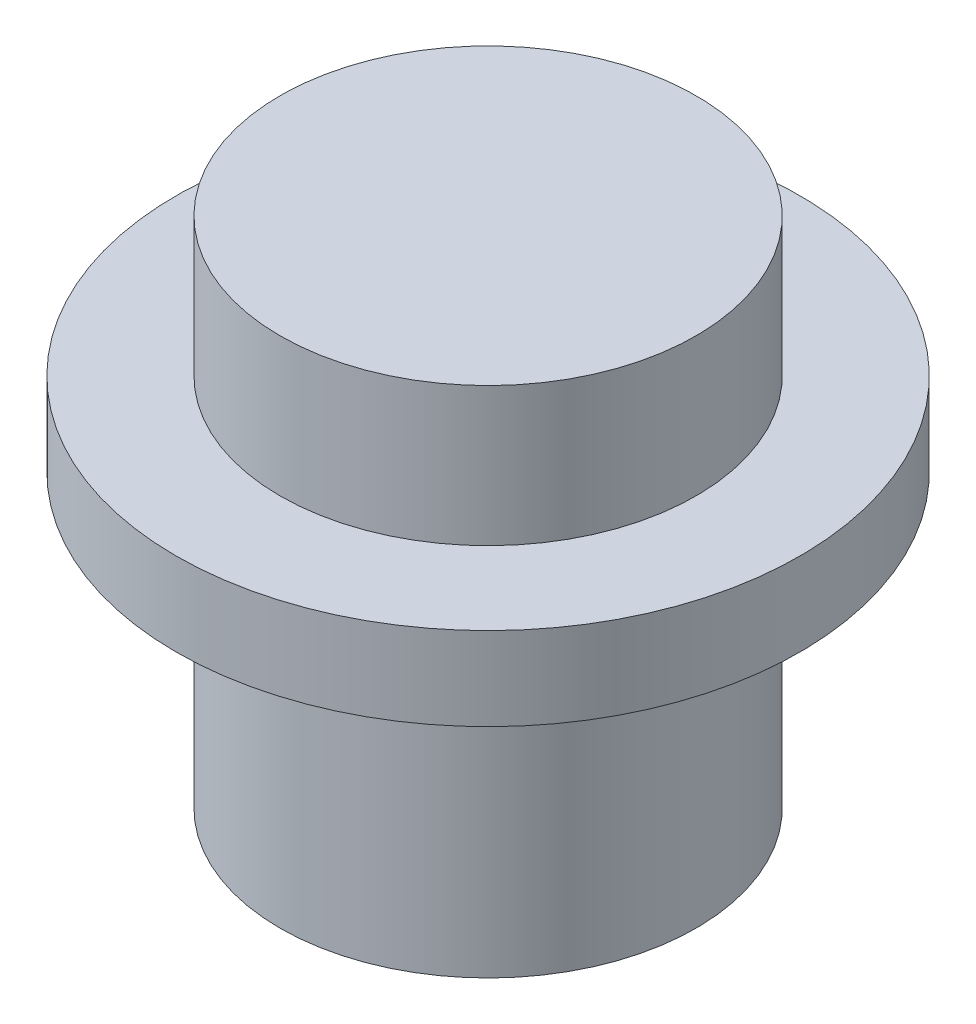
ISO-10303-21;
HEADER;
FILE_DESCRIPTION(('STEP AP214'),'2;1');
FILE_NAME('part.step','',(''),(''),'','','');
FILE_SCHEMA(('AUTOMOTIVE_DESIGN { 1 0 10303 214 1 1 1 1 }'));
ENDSEC;
DATA;
#1=APPLICATION_CONTEXT('core data for automotive mechanical design processes');
#2=APPLICATION_PROTOCOL_DEFINITION('international standard','automotive_design',2000,#1);
#3=PRODUCT_CONTEXT('',#1,'mechanical');
#4=PRODUCT('Part','Part','',(#3));
#5=PRODUCT_RELATED_PRODUCT_CATEGORY('part','',(#4));
#6=PRODUCT_DEFINITION_FORMATION('','',#4);
#7=PRODUCT_DEFINITION_CONTEXT('part definition',#1,'design');
#8=PRODUCT_DEFINITION('design','',#6,#7);
#9=PRODUCT_DEFINITION_SHAPE('','',#8);
#10=(LENGTH_UNIT() NAMED_UNIT(*) SI_UNIT(.MILLI.,.METRE.));
#11=(NAMED_UNIT(*) PLANE_ANGLE_UNIT() SI_UNIT($,.RADIAN.));
#12=(NAMED_UNIT(*) SI_UNIT($,.STERADIAN.) SOLID_ANGLE_UNIT());
#13=UNCERTAINTY_MEASURE_WITH_UNIT(LENGTH_MEASURE(1.E-05),#10,'distance_accuracy_value','');
#14=(GEOMETRIC_REPRESENTATION_CONTEXT(3) GLOBAL_UNCERTAINTY_ASSIGNED_CONTEXT((#13)) GLOBAL_UNIT_ASSIGNED_CONTEXT((#10,
#11,#12)) REPRESENTATION_CONTEXT('',''));
#15=CARTESIAN_POINT('',(0.,0.,0.));
#16=DIRECTION('',(0.,0.,1.));
#17=DIRECTION('',(1.,0.,0.));
#18=AXIS2_PLACEMENT_3D('',#15,#16,#17);
#19=CARTESIAN_POINT('',(38.,-60.6,77.));
#20=DIRECTION('',(0.,-1.,0.));
#21=DIRECTION('',(0.,0.,-1.));
#22=AXIS2_PLACEMENT_3D('',#19,#20,#21);
#23=CYLINDRICAL_SURFACE('',#22,3.);
#24=CARTESIAN_POINT('',(38.,-62.6,77.));
#25=DIRECTION('',(0.,1.,0.));
#26=DIRECTION('',(0.,0.,1.));
#27=AXIS2_PLACEMENT_3D('',#24,#25,#26);
#28=CIRCLE('',#27,3.);
#29=CARTESIAN_POINT('',(38.,-62.6,80.));
#30=VERTEX_POINT('',#29);
#31=EDGE_CURVE('E42',#30,#30,#28,.T.);
#32=ORIENTED_EDGE('',*,*,#31,.T.);
#33=EDGE_LOOP('',(#32));
#34=FACE_BOUND('',#33,.T.);
#35=CARTESIAN_POINT('',(38.,-60.6,77.));
#36=DIRECTION('',(0.,1.,0.));
#37=DIRECTION('',(0.,0.,1.));
#38=AXIS2_PLACEMENT_3D('',#35,#36,#37);
#39=CIRCLE('',#38,3.);
#40=CARTESIAN_POINT('',(38.,-60.6,80.));
#41=VERTEX_POINT('',#40);
#42=EDGE_CURVE('E46',#41,#41,#39,.T.);
#43=ORIENTED_EDGE('',*,*,#42,.F.);
#44=EDGE_LOOP('',(#43));
#45=FACE_BOUND('',#44,.T.);
#46=ADVANCED_FACE('F39',(#34,#45),#23,.T.);
#47=CARTESIAN_POINT('',(38.,-60.6,77.));
#48=DIRECTION('',(0.,1.,0.));
#49=DIRECTION('',(0.,0.,1.));
#50=AXIS2_PLACEMENT_3D('',#47,#48,#49);
#51=PLANE('',#50);
#52=ORIENTED_EDGE('',*,*,#42,.T.);
#53=EDGE_LOOP('',(#52));
#54=FACE_BOUND('',#53,.T.);
#55=ADVANCED_FACE('F78',(#54),#51,.T.);
#56=CARTESIAN_POINT('',(38.,-62.6,77.));
#57=DIRECTION('',(0.,-1.,0.));
#58=DIRECTION('',(0.,0.,-1.));
#59=AXIS2_PLACEMENT_3D('',#56,#57,#58);
#60=CYLINDRICAL_SURFACE('',#59,4.5);
#61=CARTESIAN_POINT('',(38.,-62.6,77.));
#62=DIRECTION('',(0.,1.,0.));
#63=DIRECTION('',(0.,0.,1.));
#64=AXIS2_PLACEMENT_3D('',#61,#62,#63);
#65=CIRCLE('',#64,4.5);
#66=CARTESIAN_POINT('',(38.,-62.6,81.5));
#67=VERTEX_POINT('',#66);
#68=EDGE_CURVE('E58',#67,#67,#65,.T.);
#69=ORIENTED_EDGE('',*,*,#68,.F.);
#70=EDGE_LOOP('',(#69));
#71=FACE_BOUND('',#70,.T.);
#72=CARTESIAN_POINT('',(38.,-63.8,77.));
#73=DIRECTION('',(0.,1.,0.));
#74=DIRECTION('',(0.,0.,1.));
#75=AXIS2_PLACEMENT_3D('',#72,#73,#74);
#76=CIRCLE('',#75,4.5);
#77=CARTESIAN_POINT('',(38.,-63.8,81.5));
#78=VERTEX_POINT('',#77);
#79=EDGE_CURVE('E55',#78,#78,#76,.T.);
#80=ORIENTED_EDGE('',*,*,#79,.T.);
#81=EDGE_LOOP('',(#80));
#82=FACE_BOUND('',#81,.T.);
#83=ADVANCED_FACE('F70',(#71,#82),#60,.T.);
#84=CARTESIAN_POINT('',(38.,-62.6,77.));
#85=DIRECTION('',(0.,1.,0.));
#86=DIRECTION('',(0.,0.,1.));
#87=AXIS2_PLACEMENT_3D('',#84,#85,#86);
#88=PLANE('',#87);
#89=ORIENTED_EDGE('',*,*,#31,.F.);
#90=EDGE_LOOP('',(#89));
#91=FACE_BOUND('',#90,.T.);
#92=ORIENTED_EDGE('',*,*,#68,.T.);
#93=EDGE_LOOP('',(#92));
#94=FACE_BOUND('',#93,.T.);
#95=ADVANCED_FACE('F67',(#91,#94),#88,.T.);
#96=CARTESIAN_POINT('',(38.,-63.8,77.));
#97=DIRECTION('',(0.,1.,0.));
#98=DIRECTION('',(0.,0.,1.));
#99=AXIS2_PLACEMENT_3D('',#96,#97,#98);
#100=PLANE('',#99);
#101=CARTESIAN_POINT('',(38.,-63.8,77.));
#102=DIRECTION('',(0.,1.,0.));
#103=DIRECTION('',(0.,0.,1.));
#104=AXIS2_PLACEMENT_3D('',#101,#102,#103);
#105=CIRCLE('',#104,3.);
#106=CARTESIAN_POINT('',(38.,-63.8,80.));
#107=VERTEX_POINT('',#106);
#108=EDGE_CURVE('E10',#107,#107,#105,.T.);
#109=ORIENTED_EDGE('',*,*,#108,.T.);
#110=EDGE_LOOP('',(#109));
#111=FACE_BOUND('',#110,.T.);
#112=ORIENTED_EDGE('',*,*,#79,.F.);
#113=EDGE_LOOP('',(#112));
#114=FACE_BOUND('',#113,.T.);
#115=ADVANCED_FACE('F69',(#111,#114),#100,.F.);
#116=CARTESIAN_POINT('',(38.,-68.,77.));
#117=DIRECTION('',(0.,1.,0.));
#118=DIRECTION('',(0.,0.,1.));
#119=AXIS2_PLACEMENT_3D('',#116,#117,#118);
#120=PLANE('',#119);
#121=CARTESIAN_POINT('',(38.,-68.,77.));
#122=DIRECTION('',(0.,1.,0.));
#123=DIRECTION('',(0.,0.,1.));
#124=AXIS2_PLACEMENT_3D('',#121,#122,#123);
#125=CIRCLE('',#124,3.);
#126=CARTESIAN_POINT('',(38.,-68.,80.));
#127=VERTEX_POINT('',#126);
#128=EDGE_CURVE('E50',#127,#127,#125,.T.);
#129=ORIENTED_EDGE('',*,*,#128,.F.);
#130=EDGE_LOOP('',(#129));
#131=FACE_BOUND('',#130,.T.);
#132=ADVANCED_FACE('F76',(#131),#120,.F.);
#133=ORIENTED_EDGE('',*,*,#128,.T.);
#134=EDGE_LOOP('',(#133));
#135=FACE_BOUND('',#134,.T.);
#136=ORIENTED_EDGE('',*,*,#108,.F.);
#137=EDGE_LOOP('',(#136));
#138=FACE_BOUND('',#137,.T.);
#139=ADVANCED_FACE('F82',(#135,#138),#23,.T.);
#140=CLOSED_SHELL('',(#46,#55,#83,#95,#115,#132,#139));
#141=MANIFOLD_SOLID_BREP('B2',#140);
#142=ADVANCED_BREP_SHAPE_REPRESENTATION('',(#18,#141),#14);
#143=SHAPE_DEFINITION_REPRESENTATION(#9,#142);
ENDSEC;
END-ISO-10303-21;
